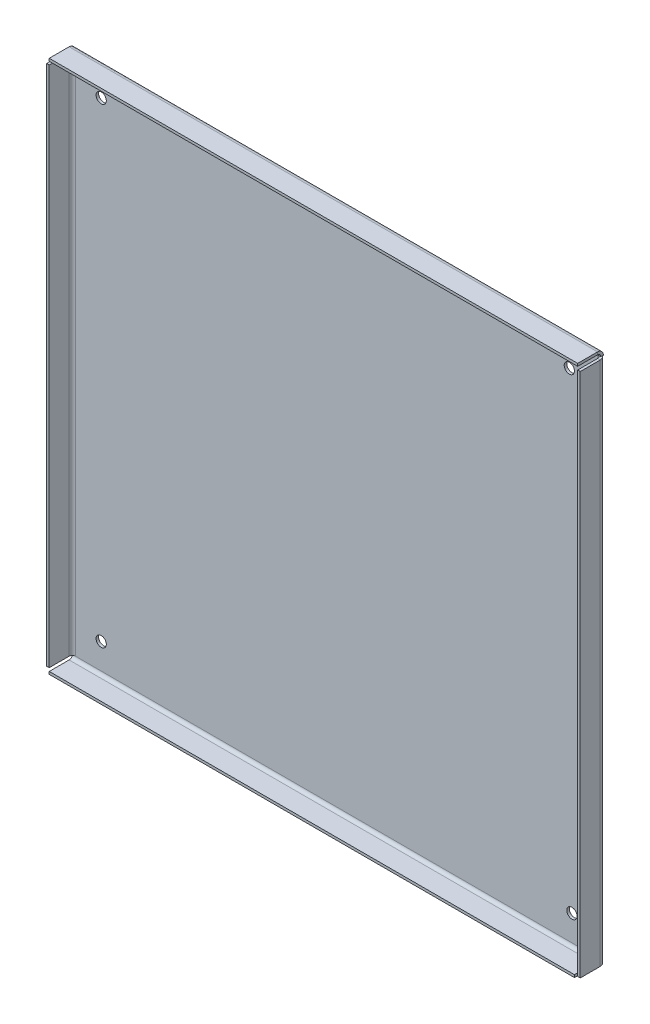
ISO-10303-21;
HEADER;
FILE_DESCRIPTION(('STEP AP214'),'2;1');
FILE_NAME('part.step','',(''),(''),'','','');
FILE_SCHEMA(('AUTOMOTIVE_DESIGN { 1 0 10303 214 1 1 1 1 }'));
ENDSEC;
DATA;
#1=APPLICATION_CONTEXT('core data for automotive mechanical design processes');
#2=APPLICATION_PROTOCOL_DEFINITION('international standard','automotive_design',2000,#1);
#3=PRODUCT_CONTEXT('',#1,'mechanical');
#4=PRODUCT('Part','Part','',(#3));
#5=PRODUCT_RELATED_PRODUCT_CATEGORY('part','',(#4));
#6=PRODUCT_DEFINITION_FORMATION('','',#4);
#7=PRODUCT_DEFINITION_CONTEXT('part definition',#1,'design');
#8=PRODUCT_DEFINITION('design','',#6,#7);
#9=PRODUCT_DEFINITION_SHAPE('','',#8);
#10=(LENGTH_UNIT() NAMED_UNIT(*) SI_UNIT(.MILLI.,.METRE.));
#11=(NAMED_UNIT(*) PLANE_ANGLE_UNIT() SI_UNIT($,.RADIAN.));
#12=(NAMED_UNIT(*) SI_UNIT($,.STERADIAN.) SOLID_ANGLE_UNIT());
#13=UNCERTAINTY_MEASURE_WITH_UNIT(LENGTH_MEASURE(1.E-05),#10,'distance_accuracy_value','');
#14=(GEOMETRIC_REPRESENTATION_CONTEXT(3) GLOBAL_UNCERTAINTY_ASSIGNED_CONTEXT((#13)) GLOBAL_UNIT_ASSIGNED_CONTEXT((#10,
#11,#12)) REPRESENTATION_CONTEXT('',''));
#15=CARTESIAN_POINT('',(0.,0.,0.));
#16=DIRECTION('',(0.,0.,1.));
#17=DIRECTION('',(1.,0.,0.));
#18=AXIS2_PLACEMENT_3D('',#15,#16,#17);
#19=CARTESIAN_POINT('',(-205.,-204.5,0.));
#20=DIRECTION('',(0.,1.,0.));
#21=DIRECTION('',(-1.,0.,0.));
#22=AXIS2_PLACEMENT_3D('',#19,#20,#21);
#23=PLANE('',#22);
#24=DIRECTION('',(0.,0.,-1.));
#25=VECTOR('',#24,1.);
#26=CARTESIAN_POINT('',(-205.,-204.5,0.));
#27=LINE('',#26,#25);
#28=CARTESIAN_POINT('',(-205.,-204.5,-1.24165738677399));
#29=VERTEX_POINT('',#28);
#30=CARTESIAN_POINT('',(-205.,-204.5,-2.00000000000002));
#31=VERTEX_POINT('',#30);
#32=EDGE_CURVE('E56',#29,#31,#27,.T.);
#33=ORIENTED_EDGE('',*,*,#32,.F.);
#34=CARTESIAN_POINT('',(-202.5,-204.5,2.5));
#35=DIRECTION('',(0.,-1.,0.));
#36=DIRECTION('',(0.,0.,-1.));
#37=AXIS2_PLACEMENT_3D('',#34,#35,#36);
#38=CIRCLE('',#37,4.50000000000003);
#39=CARTESIAN_POINT('',(-202.5,-204.5,-2.00000000000002));
#40=VERTEX_POINT('',#39);
#41=EDGE_CURVE('E11',#29,#40,#38,.T.);
#42=ORIENTED_EDGE('',*,*,#41,.T.);
#43=DIRECTION('',(1.,0.,0.));
#44=VECTOR('',#43,1.);
#45=CARTESIAN_POINT('',(204.5,-204.499999999986,-2.00000000000002));
#46=LINE('',#45,#44);
#47=EDGE_CURVE('E270',#31,#40,#46,.T.);
#48=ORIENTED_EDGE('',*,*,#47,.F.);
#49=EDGE_LOOP('',(#33,#42,#48));
#50=FACE_BOUND('',#49,.T.);
#51=ADVANCED_FACE('F39',(#50),#23,.T.);
#52=CARTESIAN_POINT('',(-202.5,202.5,0.));
#53=DIRECTION('',(0.,-1.,0.));
#54=DIRECTION('',(0.,0.,-1.));
#55=AXIS2_PLACEMENT_3D('',#52,#53,#54);
#56=PLANE('',#55);
#57=DIRECTION('',(-1.,0.,0.));
#58=VECTOR('',#57,1.);
#59=CARTESIAN_POINT('',(-205.,202.5,-2.00000000000005));
#60=LINE('',#59,#58);
#61=CARTESIAN_POINT('',(-205.,202.5,-2.00000000000005));
#62=VERTEX_POINT('',#61);
#63=CARTESIAN_POINT('',(-202.5,202.5,-2.00000000000005));
#64=VERTEX_POINT('',#63);
#65=EDGE_CURVE('E422',#62,#64,#60,.F.);
#66=ORIENTED_EDGE('',*,*,#65,.T.);
#67=CARTESIAN_POINT('',(-202.5,202.5,2.49999999999996));
#68=DIRECTION('',(0.,-1.,0.));
#69=DIRECTION('',(0.,0.,-1.));
#70=AXIS2_PLACEMENT_3D('',#67,#68,#69);
#71=CIRCLE('',#70,4.50000000000003);
#72=CARTESIAN_POINT('',(-205.,202.5,-1.24165738677399));
#73=VERTEX_POINT('',#72);
#74=EDGE_CURVE('E255',#64,#73,#71,.F.);
#75=ORIENTED_EDGE('',*,*,#74,.T.);
#76=DIRECTION('',(0.,0.,-1.));
#77=VECTOR('',#76,1.);
#78=CARTESIAN_POINT('',(-205.,202.5,0.));
#79=LINE('',#78,#77);
#80=EDGE_CURVE('E428',#73,#62,#79,.T.);
#81=ORIENTED_EDGE('',*,*,#80,.T.);
#82=EDGE_LOOP('',(#66,#75,#81));
#83=FACE_BOUND('',#82,.T.);
#84=ADVANCED_FACE('F590',(#83),#56,.T.);
#85=CARTESIAN_POINT('',(0.,0.,-2.));
#86=DIRECTION('',(0.,0.,-1.));
#87=DIRECTION('',(-1.,0.,0.));
#88=AXIS2_PLACEMENT_3D('',#85,#86,#87);
#89=PLANE('',#88);
#90=CARTESIAN_POINT('',(-182.5,-184.5,-2.));
#91=DIRECTION('',(0.,0.,-1.));
#92=DIRECTION('',(-1.,0.,0.));
#93=AXIS2_PLACEMENT_3D('',#90,#91,#92);
#94=CIRCLE('',#93,3.99999999999999);
#95=CARTESIAN_POINT('',(-186.5,-184.5,-2.));
#96=VERTEX_POINT('',#95);
#97=EDGE_CURVE('E455',#96,#96,#94,.T.);
#98=ORIENTED_EDGE('',*,*,#97,.F.);
#99=EDGE_LOOP('',(#98));
#100=FACE_BOUND('',#99,.T.);
#101=CARTESIAN_POINT('',(-182.5,182.5,-2.));
#102=DIRECTION('',(0.,0.,-1.));
#103=DIRECTION('',(-1.,0.,0.));
#104=AXIS2_PLACEMENT_3D('',#101,#102,#103);
#105=CIRCLE('',#104,3.99999999999999);
#106=CARTESIAN_POINT('',(-186.5,182.5,-2.));
#107=VERTEX_POINT('',#106);
#108=EDGE_CURVE('E684',#107,#107,#105,.T.);
#109=ORIENTED_EDGE('',*,*,#108,.F.);
#110=EDGE_LOOP('',(#109));
#111=FACE_BOUND('',#110,.T.);
#112=CARTESIAN_POINT('',(182.5,182.5,-2.));
#113=DIRECTION('',(0.,0.,-1.));
#114=DIRECTION('',(-1.,0.,0.));
#115=AXIS2_PLACEMENT_3D('',#112,#113,#114);
#116=CIRCLE('',#115,3.99999999999999);
#117=CARTESIAN_POINT('',(178.5,182.5,-2.));
#118=VERTEX_POINT('',#117);
#119=EDGE_CURVE('E468',#118,#118,#116,.T.);
#120=ORIENTED_EDGE('',*,*,#119,.F.);
#121=EDGE_LOOP('',(#120));
#122=FACE_BOUND('',#121,.T.);
#123=CARTESIAN_POINT('',(184.5,-184.5,-2.));
#124=DIRECTION('',(0.,0.,-1.));
#125=DIRECTION('',(-1.,0.,0.));
#126=AXIS2_PLACEMENT_3D('',#123,#124,#125);
#127=CIRCLE('',#126,3.99999999999999);
#128=CARTESIAN_POINT('',(180.5,-184.5,-2.));
#129=VERTEX_POINT('',#128);
#130=EDGE_CURVE('E451',#129,#129,#127,.T.);
#131=ORIENTED_EDGE('',*,*,#130,.F.);
#132=EDGE_LOOP('',(#131));
#133=FACE_BOUND('',#132,.T.);
#134=DIRECTION('',(1.,0.,0.));
#135=VECTOR('',#134,1.);
#136=CARTESIAN_POINT('',(204.5,-204.5,-2.00000000000002));
#137=LINE('',#136,#135);
#138=CARTESIAN_POINT('',(204.5,-204.5,-1.99999999999999));
#139=VERTEX_POINT('',#138);
#140=EDGE_CURVE('E306',#139,#40,#137,.F.);
#141=ORIENTED_EDGE('',*,*,#140,.T.);
#142=DIRECTION('',(0.,-1.,0.));
#143=VECTOR('',#142,1.);
#144=CARTESIAN_POINT('',(-202.5,-204.5,-2.00000000000003));
#145=LINE('',#144,#143);
#146=EDGE_CURVE('E251',#40,#64,#145,.F.);
#147=ORIENTED_EDGE('',*,*,#146,.T.);
#148=CARTESIAN_POINT('',(204.5,202.5,-2.00000000000002));
#149=VERTEX_POINT('',#148);
#150=EDGE_CURVE('E425',#64,#149,#60,.F.);
#151=ORIENTED_EDGE('',*,*,#150,.T.);
#152=DIRECTION('',(0.,1.,0.));
#153=VECTOR('',#152,1.);
#154=CARTESIAN_POINT('',(204.5,202.5,-1.99999999999999));
#155=LINE('',#154,#153);
#156=EDGE_CURVE('E364',#149,#139,#155,.F.);
#157=ORIENTED_EDGE('',*,*,#156,.T.);
#158=EDGE_LOOP('',(#141,#147,#151,#157));
#159=FACE_BOUND('',#158,.T.);
#160=ADVANCED_FACE('F595',(#100,#111,#122,#133,#159),#89,.T.);
#161=CARTESIAN_POINT('',(0.,0.,0.));
#162=DIRECTION('',(0.,0.,-1.));
#163=DIRECTION('',(-1.,0.,0.));
#164=AXIS2_PLACEMENT_3D('',#161,#162,#163);
#165=PLANE('',#164);
#166=CARTESIAN_POINT('',(-182.5,-184.5,0.));
#167=DIRECTION('',(0.,0.,-1.));
#168=DIRECTION('',(-1.,0.,0.));
#169=AXIS2_PLACEMENT_3D('',#166,#167,#168);
#170=CIRCLE('',#169,3.99999999999999);
#171=CARTESIAN_POINT('',(-186.5,-184.5,0.));
#172=VERTEX_POINT('',#171);
#173=EDGE_CURVE('E43',#172,#172,#170,.T.);
#174=ORIENTED_EDGE('',*,*,#173,.T.);
#175=EDGE_LOOP('',(#174));
#176=FACE_BOUND('',#175,.T.);
#177=CARTESIAN_POINT('',(-182.5,182.5,0.));
#178=DIRECTION('',(0.,0.,-1.));
#179=DIRECTION('',(-1.,0.,0.));
#180=AXIS2_PLACEMENT_3D('',#177,#178,#179);
#181=CIRCLE('',#180,3.99999999999999);
#182=CARTESIAN_POINT('',(-186.5,182.5,0.));
#183=VERTEX_POINT('',#182);
#184=EDGE_CURVE('E454',#183,#183,#181,.T.);
#185=ORIENTED_EDGE('',*,*,#184,.T.);
#186=EDGE_LOOP('',(#185));
#187=FACE_BOUND('',#186,.T.);
#188=CARTESIAN_POINT('',(182.5,182.5,0.));
#189=DIRECTION('',(0.,0.,-1.));
#190=DIRECTION('',(-1.,0.,0.));
#191=AXIS2_PLACEMENT_3D('',#188,#189,#190);
#192=CIRCLE('',#191,3.99999999999999);
#193=CARTESIAN_POINT('',(178.5,182.5,0.));
#194=VERTEX_POINT('',#193);
#195=EDGE_CURVE('E452',#194,#194,#192,.T.);
#196=ORIENTED_EDGE('',*,*,#195,.T.);
#197=EDGE_LOOP('',(#196));
#198=FACE_BOUND('',#197,.T.);
#199=CARTESIAN_POINT('',(184.5,-184.5,0.));
#200=DIRECTION('',(0.,0.,-1.));
#201=DIRECTION('',(-1.,0.,0.));
#202=AXIS2_PLACEMENT_3D('',#199,#200,#201);
#203=CIRCLE('',#202,3.99999999999999);
#204=CARTESIAN_POINT('',(180.5,-184.5,0.));
#205=VERTEX_POINT('',#204);
#206=EDGE_CURVE('E448',#205,#205,#203,.T.);
#207=ORIENTED_EDGE('',*,*,#206,.T.);
#208=EDGE_LOOP('',(#207));
#209=FACE_BOUND('',#208,.T.);
#210=DIRECTION('',(0.,-1.,0.));
#211=VECTOR('',#210,1.);
#212=CARTESIAN_POINT('',(-202.5,-204.5,0.));
#213=LINE('',#212,#211);
#214=CARTESIAN_POINT('',(-202.5,-204.5,0.));
#215=VERTEX_POINT('',#214);
#216=CARTESIAN_POINT('',(-202.5,202.5,0.));
#217=VERTEX_POINT('',#216);
#218=EDGE_CURVE('E263',#215,#217,#213,.F.);
#219=ORIENTED_EDGE('',*,*,#218,.F.);
#220=DIRECTION('',(1.,0.,0.));
#221=VECTOR('',#220,1.);
#222=CARTESIAN_POINT('',(204.5,-204.5,0.));
#223=LINE('',#222,#221);
#224=CARTESIAN_POINT('',(204.5,-204.5,0.));
#225=VERTEX_POINT('',#224);
#226=EDGE_CURVE('E318',#225,#215,#223,.F.);
#227=ORIENTED_EDGE('',*,*,#226,.F.);
#228=DIRECTION('',(0.,1.,0.));
#229=VECTOR('',#228,1.);
#230=CARTESIAN_POINT('',(204.5,202.5,0.));
#231=LINE('',#230,#229);
#232=CARTESIAN_POINT('',(204.5,202.5,0.));
#233=VERTEX_POINT('',#232);
#234=EDGE_CURVE('E377',#233,#225,#231,.F.);
#235=ORIENTED_EDGE('',*,*,#234,.F.);
#236=DIRECTION('',(-1.,0.,0.));
#237=VECTOR('',#236,1.);
#238=CARTESIAN_POINT('',(-205.,202.5,0.));
#239=LINE('',#238,#237);
#240=EDGE_CURVE('E438',#217,#233,#239,.F.);
#241=ORIENTED_EDGE('',*,*,#240,.F.);
#242=EDGE_LOOP('',(#219,#227,#235,#241));
#243=FACE_BOUND('',#242,.T.);
#244=ADVANCED_FACE('F41',(#176,#187,#198,#209,#243),#165,.F.);
#245=CARTESIAN_POINT('',(204.5,-207.,0.));
#246=DIRECTION('',(-1.,0.,0.));
#247=DIRECTION('',(0.,-1.,0.));
#248=AXIS2_PLACEMENT_3D('',#245,#246,#247);
#249=PLANE('',#248);
#250=DIRECTION('',(0.,0.,-1.));
#251=VECTOR('',#250,1.);
#252=CARTESIAN_POINT('',(204.5,-207.,0.));
#253=LINE('',#252,#251);
#254=CARTESIAN_POINT('',(204.5,-207.,-1.24165738677398));
#255=VERTEX_POINT('',#254);
#256=CARTESIAN_POINT('',(204.5,-207.,-1.99999999999999));
#257=VERTEX_POINT('',#256);
#258=EDGE_CURVE('E64',#255,#257,#253,.T.);
#259=ORIENTED_EDGE('',*,*,#258,.F.);
#260=CARTESIAN_POINT('',(204.5,-204.5,2.50000000000001));
#261=DIRECTION('',(1.,0.,0.));
#262=DIRECTION('',(0.,0.,-1.));
#263=AXIS2_PLACEMENT_3D('',#260,#261,#262);
#264=CIRCLE('',#263,4.50000000000003);
#265=EDGE_CURVE('E48',#255,#139,#264,.T.);
#266=ORIENTED_EDGE('',*,*,#265,.T.);
#267=DIRECTION('',(0.,1.,0.));
#268=VECTOR('',#267,1.);
#269=CARTESIAN_POINT('',(204.499999999982,202.5,-1.99999999999999));
#270=LINE('',#269,#268);
#271=EDGE_CURVE('E328',#257,#139,#270,.T.);
#272=ORIENTED_EDGE('',*,*,#271,.F.);
#273=EDGE_LOOP('',(#259,#266,#272));
#274=FACE_BOUND('',#273,.T.);
#275=ADVANCED_FACE('F632',(#274),#249,.T.);
#276=CARTESIAN_POINT('',(207.,202.5,0.));
#277=DIRECTION('',(0.,-1.,0.));
#278=DIRECTION('',(1.,0.,0.));
#279=AXIS2_PLACEMENT_3D('',#276,#277,#278);
#280=PLANE('',#279);
#281=DIRECTION('',(0.,0.,-1.));
#282=VECTOR('',#281,1.);
#283=CARTESIAN_POINT('',(207.,202.5,0.));
#284=LINE('',#283,#282);
#285=CARTESIAN_POINT('',(207.,202.5,-1.24165738677397));
#286=VERTEX_POINT('',#285);
#287=CARTESIAN_POINT('',(207.,202.5,-2.00000000000002));
#288=VERTEX_POINT('',#287);
#289=EDGE_CURVE('E444',#286,#288,#284,.T.);
#290=ORIENTED_EDGE('',*,*,#289,.F.);
#291=CARTESIAN_POINT('',(204.5,202.5,2.50000000000001));
#292=DIRECTION('',(0.,1.,0.));
#293=DIRECTION('',(0.,0.,1.));
#294=AXIS2_PLACEMENT_3D('',#291,#292,#293);
#295=CIRCLE('',#294,4.5);
#296=EDGE_CURVE('E374',#286,#149,#295,.T.);
#297=ORIENTED_EDGE('',*,*,#296,.T.);
#298=DIRECTION('',(-1.,0.,0.));
#299=VECTOR('',#298,1.);
#300=CARTESIAN_POINT('',(-205.,202.499999999977,-2.00000000000005));
#301=LINE('',#300,#299);
#302=EDGE_CURVE('E386',#288,#149,#301,.T.);
#303=ORIENTED_EDGE('',*,*,#302,.F.);
#304=EDGE_LOOP('',(#290,#297,#303));
#305=FACE_BOUND('',#304,.T.);
#306=ADVANCED_FACE('F635',(#305),#280,.T.);
#307=CARTESIAN_POINT('',(207.,202.5,2.50000000000001));
#308=DIRECTION('',(1.,0.,0.));
#309=DIRECTION('',(0.,0.,-1.));
#310=AXIS2_PLACEMENT_3D('',#307,#308,#309);
#311=PLANE('',#310);
#312=DIRECTION('',(0.,1.,0.));
#313=VECTOR('',#312,1.);
#314=CARTESIAN_POINT('',(207.,205.,2.5));
#315=LINE('',#314,#313);
#316=CARTESIAN_POINT('',(207.,205.,2.50000000000001));
#317=VERTEX_POINT('',#316);
#318=CARTESIAN_POINT('',(207.,207.,2.5));
#319=VERTEX_POINT('',#318);
#320=EDGE_CURVE('E389',#317,#319,#315,.T.);
#321=ORIENTED_EDGE('',*,*,#320,.F.);
#322=CARTESIAN_POINT('',(207.,202.5,2.50000000000001));
#323=DIRECTION('',(-1.,0.,0.));
#324=DIRECTION('',(0.,0.,1.));
#325=AXIS2_PLACEMENT_3D('',#322,#323,#324);
#326=CIRCLE('',#325,2.50000000000003);
#327=CARTESIAN_POINT('',(207.,202.5,0.));
#328=VERTEX_POINT('',#327);
#329=EDGE_CURVE('E432',#328,#317,#326,.F.);
#330=ORIENTED_EDGE('',*,*,#329,.F.);
#331=EDGE_CURVE('E441',#328,#286,#284,.T.);
#332=ORIENTED_EDGE('',*,*,#331,.T.);
#333=ORIENTED_EDGE('',*,*,#289,.T.);
#334=CARTESIAN_POINT('',(207.,202.5,2.50000000000001));
#335=DIRECTION('',(-1.,0.,0.));
#336=DIRECTION('',(0.,0.,1.));
#337=AXIS2_PLACEMENT_3D('',#334,#335,#336);
#338=CIRCLE('',#337,4.50000000000003);
#339=EDGE_CURVE('E424',#288,#319,#338,.F.);
#340=ORIENTED_EDGE('',*,*,#339,.T.);
#341=EDGE_LOOP('',(#321,#330,#332,#333,#340));
#342=FACE_BOUND('',#341,.T.);
#343=ADVANCED_FACE('F559',(#342),#311,.T.);
#344=CARTESIAN_POINT('',(-205.,202.5,2.49999999999998));
#345=DIRECTION('',(1.,0.,0.));
#346=DIRECTION('',(0.,0.,-1.));
#347=AXIS2_PLACEMENT_3D('',#344,#345,#346);
#348=PLANE('',#347);
#349=CARTESIAN_POINT('',(-205.,202.5,2.49999999999998));
#350=DIRECTION('',(-1.,0.,0.));
#351=DIRECTION('',(0.,0.,1.));
#352=AXIS2_PLACEMENT_3D('',#349,#350,#351);
#353=CIRCLE('',#352,2.50000000000003);
#354=CARTESIAN_POINT('',(-205.,205.,2.49999999999997));
#355=VERTEX_POINT('',#354);
#356=CARTESIAN_POINT('',(-205.,202.5,0.));
#357=VERTEX_POINT('',#356);
#358=EDGE_CURVE('E419',#355,#357,#353,.T.);
#359=ORIENTED_EDGE('',*,*,#358,.F.);
#360=DIRECTION('',(0.,1.,0.));
#361=VECTOR('',#360,1.);
#362=CARTESIAN_POINT('',(-205.,205.,2.49999999999997));
#363=LINE('',#362,#361);
#364=CARTESIAN_POINT('',(-205.,207.,2.49999999999998));
#365=VERTEX_POINT('',#364);
#366=EDGE_CURVE('E392',#355,#365,#363,.T.);
#367=ORIENTED_EDGE('',*,*,#366,.T.);
#368=CARTESIAN_POINT('',(-205.,202.5,2.49999999999998));
#369=DIRECTION('',(-1.,0.,0.));
#370=DIRECTION('',(0.,0.,1.));
#371=AXIS2_PLACEMENT_3D('',#368,#369,#370);
#372=CIRCLE('',#371,4.50000000000003);
#373=EDGE_CURVE('E429',#365,#62,#372,.T.);
#374=ORIENTED_EDGE('',*,*,#373,.T.);
#375=ORIENTED_EDGE('',*,*,#80,.F.);
#376=EDGE_CURVE('E445',#357,#73,#79,.T.);
#377=ORIENTED_EDGE('',*,*,#376,.F.);
#378=EDGE_LOOP('',(#359,#367,#374,#375,#377));
#379=FACE_BOUND('',#378,.T.);
#380=ADVANCED_FACE('F582',(#379),#348,.F.);
#381=CARTESIAN_POINT('',(-205.,202.5,2.49999999999998));
#382=DIRECTION('',(-1.,0.,0.));
#383=DIRECTION('',(0.,1.,0.));
#384=AXIS2_PLACEMENT_3D('',#381,#382,#383);
#385=CYLINDRICAL_SURFACE('',#384,4.50000000000003);
#386=ORIENTED_EDGE('',*,*,#65,.F.);
#387=ORIENTED_EDGE('',*,*,#373,.F.);
#388=DIRECTION('',(-1.,0.,0.));
#389=VECTOR('',#388,1.);
#390=CARTESIAN_POINT('',(0.,207.,2.49999999999998));
#391=LINE('',#390,#389);
#392=EDGE_CURVE('E395',#319,#365,#391,.T.);
#393=ORIENTED_EDGE('',*,*,#392,.F.);
#394=ORIENTED_EDGE('',*,*,#339,.F.);
#395=ORIENTED_EDGE('',*,*,#302,.T.);
#396=ORIENTED_EDGE('',*,*,#150,.F.);
#397=EDGE_LOOP('',(#386,#387,#393,#394,#395,#396));
#398=FACE_BOUND('',#397,.T.);
#399=ADVANCED_FACE('F598',(#398),#385,.T.);
#400=CARTESIAN_POINT('',(-205.,202.5,2.49999999999998));
#401=DIRECTION('',(-1.,0.,0.));
#402=DIRECTION('',(0.,1.,0.));
#403=AXIS2_PLACEMENT_3D('',#400,#401,#402);
#404=CYLINDRICAL_SURFACE('',#403,2.50000000000003);
#405=EDGE_CURVE('E435',#357,#217,#239,.F.);
#406=ORIENTED_EDGE('',*,*,#405,.T.);
#407=ORIENTED_EDGE('',*,*,#240,.T.);
#408=DIRECTION('',(-1.,0.,0.));
#409=VECTOR('',#408,1.);
#410=CARTESIAN_POINT('',(207.,202.5,0.));
#411=LINE('',#410,#409);
#412=EDGE_CURVE('E383',#328,#233,#411,.T.);
#413=ORIENTED_EDGE('',*,*,#412,.F.);
#414=ORIENTED_EDGE('',*,*,#329,.T.);
#415=DIRECTION('',(-1.,0.,0.));
#416=VECTOR('',#415,1.);
#417=CARTESIAN_POINT('',(207.,205.,2.5));
#418=LINE('',#417,#416);
#419=EDGE_CURVE('E390',#317,#355,#418,.T.);
#420=ORIENTED_EDGE('',*,*,#419,.T.);
#421=ORIENTED_EDGE('',*,*,#358,.T.);
#422=EDGE_LOOP('',(#406,#407,#413,#414,#420,#421));
#423=FACE_BOUND('',#422,.T.);
#424=ADVANCED_FACE('F556',(#423),#404,.F.);
#425=CARTESIAN_POINT('',(-205.,207.,0.));
#426=DIRECTION('',(-1.,0.,0.));
#427=DIRECTION('',(0.,0.,1.));
#428=AXIS2_PLACEMENT_3D('',#425,#426,#427);
#429=PLANE('',#428);
#430=DIRECTION('',(0.,0.,-1.));
#431=VECTOR('',#430,1.);
#432=CARTESIAN_POINT('',(-205.,207.,0.));
#433=LINE('',#432,#431);
#434=CARTESIAN_POINT('',(-205.,207.,18.));
#435=VERTEX_POINT('',#434);
#436=EDGE_CURVE('E407',#435,#365,#433,.T.);
#437=ORIENTED_EDGE('',*,*,#436,.T.);
#438=ORIENTED_EDGE('',*,*,#366,.F.);
#439=DIRECTION('',(0.,0.,-1.));
#440=VECTOR('',#439,1.);
#441=CARTESIAN_POINT('',(-205.,205.,0.));
#442=LINE('',#441,#440);
#443=CARTESIAN_POINT('',(-205.,205.,18.));
#444=VERTEX_POINT('',#443);
#445=EDGE_CURVE('E404',#444,#355,#442,.T.);
#446=ORIENTED_EDGE('',*,*,#445,.F.);
#447=DIRECTION('',(0.,-1.,0.));
#448=VECTOR('',#447,1.);
#449=CARTESIAN_POINT('',(-205.,207.,18.));
#450=LINE('',#449,#448);
#451=EDGE_CURVE('E417',#435,#444,#450,.T.);
#452=ORIENTED_EDGE('',*,*,#451,.F.);
#453=EDGE_LOOP('',(#437,#438,#446,#452));
#454=FACE_BOUND('',#453,.T.);
#455=ADVANCED_FACE('F579',(#454),#429,.T.);
#456=CARTESIAN_POINT('',(207.,207.,18.));
#457=DIRECTION('',(1.,0.,0.));
#458=DIRECTION('',(0.,1.,0.));
#459=AXIS2_PLACEMENT_3D('',#456,#457,#458);
#460=PLANE('',#459);
#461=DIRECTION('',(0.,0.,1.));
#462=VECTOR('',#461,1.);
#463=CARTESIAN_POINT('',(207.,205.,18.));
#464=LINE('',#463,#462);
#465=CARTESIAN_POINT('',(207.,205.,18.));
#466=VERTEX_POINT('',#465);
#467=EDGE_CURVE('E400',#317,#466,#464,.T.);
#468=ORIENTED_EDGE('',*,*,#467,.F.);
#469=ORIENTED_EDGE('',*,*,#320,.T.);
#470=DIRECTION('',(0.,0.,1.));
#471=VECTOR('',#470,1.);
#472=CARTESIAN_POINT('',(207.,207.,18.));
#473=LINE('',#472,#471);
#474=CARTESIAN_POINT('',(207.,207.,18.));
#475=VERTEX_POINT('',#474);
#476=EDGE_CURVE('E401',#319,#475,#473,.T.);
#477=ORIENTED_EDGE('',*,*,#476,.T.);
#478=DIRECTION('',(0.,-1.,0.));
#479=VECTOR('',#478,1.);
#480=CARTESIAN_POINT('',(207.,207.,18.));
#481=LINE('',#480,#479);
#482=EDGE_CURVE('E410',#475,#466,#481,.T.);
#483=ORIENTED_EDGE('',*,*,#482,.T.);
#484=EDGE_LOOP('',(#468,#469,#477,#483));
#485=FACE_BOUND('',#484,.T.);
#486=ADVANCED_FACE('F565',(#485),#460,.T.);
#487=CARTESIAN_POINT('',(0.,207.,-6.39193296144789E-13));
#488=DIRECTION('',(0.,1.,0.));
#489=DIRECTION('',(0.,0.,1.));
#490=AXIS2_PLACEMENT_3D('',#487,#488,#489);
#491=PLANE('',#490);
#492=ORIENTED_EDGE('',*,*,#476,.F.);
#493=ORIENTED_EDGE('',*,*,#392,.T.);
#494=ORIENTED_EDGE('',*,*,#436,.F.);
#495=DIRECTION('',(-1.,0.,0.));
#496=VECTOR('',#495,1.);
#497=CARTESIAN_POINT('',(-205.,207.,18.));
#498=LINE('',#497,#496);
#499=EDGE_CURVE('E403',#475,#435,#498,.T.);
#500=ORIENTED_EDGE('',*,*,#499,.F.);
#501=EDGE_LOOP('',(#492,#493,#494,#500));
#502=FACE_BOUND('',#501,.T.);
#503=ADVANCED_FACE('F569',(#502),#491,.T.);
#504=CARTESIAN_POINT('',(0.,205.,-6.32210333467103E-13));
#505=DIRECTION('',(0.,1.,0.));
#506=DIRECTION('',(0.,0.,1.));
#507=AXIS2_PLACEMENT_3D('',#504,#505,#506);
#508=PLANE('',#507);
#509=ORIENTED_EDGE('',*,*,#419,.F.);
#510=ORIENTED_EDGE('',*,*,#467,.T.);
#511=DIRECTION('',(-1.,0.,0.));
#512=VECTOR('',#511,1.);
#513=CARTESIAN_POINT('',(-205.,205.,18.));
#514=LINE('',#513,#512);
#515=EDGE_CURVE('E412',#466,#444,#514,.T.);
#516=ORIENTED_EDGE('',*,*,#515,.T.);
#517=ORIENTED_EDGE('',*,*,#445,.T.);
#518=EDGE_LOOP('',(#509,#510,#516,#517));
#519=FACE_BOUND('',#518,.T.);
#520=ADVANCED_FACE('F576',(#519),#508,.F.);
#521=CARTESIAN_POINT('',(-205.,207.,18.));
#522=DIRECTION('',(0.,0.,1.));
#523=DIRECTION('',(0.,-1.,0.));
#524=AXIS2_PLACEMENT_3D('',#521,#522,#523);
#525=PLANE('',#524);
#526=ORIENTED_EDGE('',*,*,#515,.F.);
#527=ORIENTED_EDGE('',*,*,#482,.F.);
#528=ORIENTED_EDGE('',*,*,#499,.T.);
#529=ORIENTED_EDGE('',*,*,#451,.T.);
#530=EDGE_LOOP('',(#526,#527,#528,#529));
#531=FACE_BOUND('',#530,.T.);
#532=ADVANCED_FACE('F573',(#531),#525,.T.);
#533=CARTESIAN_POINT('',(204.5,202.5,2.50000000000001));
#534=DIRECTION('',(0.,-1.,0.));
#535=DIRECTION('',(0.,0.,-1.));
#536=AXIS2_PLACEMENT_3D('',#533,#534,#535);
#537=PLANE('',#536);
#538=ORIENTED_EDGE('',*,*,#331,.F.);
#539=ORIENTED_EDGE('',*,*,#412,.T.);
#540=CARTESIAN_POINT('',(204.5,202.5,2.50000000000001));
#541=DIRECTION('',(0.,1.,0.));
#542=DIRECTION('',(0.,0.,1.));
#543=AXIS2_PLACEMENT_3D('',#540,#541,#542);
#544=CIRCLE('',#543,2.5);
#545=CARTESIAN_POINT('',(207.,202.5,2.5));
#546=VERTEX_POINT('',#545);
#547=EDGE_CURVE('E361',#546,#233,#544,.T.);
#548=ORIENTED_EDGE('',*,*,#547,.F.);
#549=DIRECTION('',(1.,0.,0.));
#550=VECTOR('',#549,1.);
#551=CARTESIAN_POINT('',(207.,202.5,2.5));
#552=LINE('',#551,#550);
#553=CARTESIAN_POINT('',(209.,202.5,2.5));
#554=VERTEX_POINT('',#553);
#555=EDGE_CURVE('E334',#546,#554,#552,.T.);
#556=ORIENTED_EDGE('',*,*,#555,.T.);
#557=EDGE_CURVE('E368',#554,#286,#295,.T.);
#558=ORIENTED_EDGE('',*,*,#557,.T.);
#559=EDGE_LOOP('',(#538,#539,#548,#556,#558));
#560=FACE_BOUND('',#559,.T.);
#561=ADVANCED_FACE('F553',(#560),#537,.F.);
#562=CARTESIAN_POINT('',(204.5,-207.,2.50000000000001));
#563=DIRECTION('',(0.,-1.,0.));
#564=DIRECTION('',(0.,0.,-1.));
#565=AXIS2_PLACEMENT_3D('',#562,#563,#564);
#566=PLANE('',#565);
#567=DIRECTION('',(1.,0.,0.));
#568=VECTOR('',#567,1.);
#569=CARTESIAN_POINT('',(207.,-207.,2.5));
#570=LINE('',#569,#568);
#571=CARTESIAN_POINT('',(207.,-207.,2.5));
#572=VERTEX_POINT('',#571);
#573=CARTESIAN_POINT('',(209.,-207.,2.5));
#574=VERTEX_POINT('',#573);
#575=EDGE_CURVE('E331',#572,#574,#570,.T.);
#576=ORIENTED_EDGE('',*,*,#575,.F.);
#577=CARTESIAN_POINT('',(204.5,-207.,2.50000000000001));
#578=DIRECTION('',(0.,1.,0.));
#579=DIRECTION('',(0.,0.,1.));
#580=AXIS2_PLACEMENT_3D('',#577,#578,#579);
#581=CIRCLE('',#580,2.5);
#582=CARTESIAN_POINT('',(204.5,-207.,0.));
#583=VERTEX_POINT('',#582);
#584=EDGE_CURVE('E373',#583,#572,#581,.F.);
#585=ORIENTED_EDGE('',*,*,#584,.F.);
#586=EDGE_CURVE('E381',#583,#255,#253,.T.);
#587=ORIENTED_EDGE('',*,*,#586,.T.);
#588=ORIENTED_EDGE('',*,*,#258,.T.);
#589=CARTESIAN_POINT('',(204.5,-207.,2.50000000000001));
#590=DIRECTION('',(0.,1.,0.));
#591=DIRECTION('',(0.,0.,1.));
#592=AXIS2_PLACEMENT_3D('',#589,#590,#591);
#593=CIRCLE('',#592,4.5);
#594=EDGE_CURVE('E367',#257,#574,#593,.F.);
#595=ORIENTED_EDGE('',*,*,#594,.T.);
#596=EDGE_LOOP('',(#576,#585,#587,#588,#595));
#597=FACE_BOUND('',#596,.T.);
#598=ADVANCED_FACE('F529',(#597),#566,.T.);
#599=CARTESIAN_POINT('',(204.5,202.5,2.50000000000001));
#600=DIRECTION('',(0.,1.,0.));
#601=DIRECTION('',(1.,0.,0.));
#602=AXIS2_PLACEMENT_3D('',#599,#600,#601);
#603=CYLINDRICAL_SURFACE('',#602,4.5);
#604=ORIENTED_EDGE('',*,*,#156,.F.);
#605=ORIENTED_EDGE('',*,*,#296,.F.);
#606=ORIENTED_EDGE('',*,*,#557,.F.);
#607=DIRECTION('',(0.,1.,0.));
#608=VECTOR('',#607,1.);
#609=CARTESIAN_POINT('',(209.,0.,2.5));
#610=LINE('',#609,#608);
#611=EDGE_CURVE('E337',#574,#554,#610,.T.);
#612=ORIENTED_EDGE('',*,*,#611,.F.);
#613=ORIENTED_EDGE('',*,*,#594,.F.);
#614=ORIENTED_EDGE('',*,*,#271,.T.);
#615=EDGE_LOOP('',(#604,#605,#606,#612,#613,#614));
#616=FACE_BOUND('',#615,.T.);
#617=ADVANCED_FACE('F603',(#616),#603,.T.);
#618=CARTESIAN_POINT('',(204.5,202.5,2.50000000000001));
#619=DIRECTION('',(0.,1.,0.));
#620=DIRECTION('',(1.,0.,0.));
#621=AXIS2_PLACEMENT_3D('',#618,#619,#620);
#622=CYLINDRICAL_SURFACE('',#621,2.5);
#623=ORIENTED_EDGE('',*,*,#234,.T.);
#624=DIRECTION('',(0.,1.,0.));
#625=VECTOR('',#624,1.);
#626=CARTESIAN_POINT('',(204.5,-207.,0.));
#627=LINE('',#626,#625);
#628=EDGE_CURVE('E325',#583,#225,#627,.T.);
#629=ORIENTED_EDGE('',*,*,#628,.F.);
#630=ORIENTED_EDGE('',*,*,#584,.T.);
#631=DIRECTION('',(0.,1.,0.));
#632=VECTOR('',#631,1.);
#633=CARTESIAN_POINT('',(207.,-207.,2.5));
#634=LINE('',#633,#632);
#635=EDGE_CURVE('E332',#572,#546,#634,.T.);
#636=ORIENTED_EDGE('',*,*,#635,.T.);
#637=ORIENTED_EDGE('',*,*,#547,.T.);
#638=EDGE_LOOP('',(#623,#629,#630,#636,#637));
#639=FACE_BOUND('',#638,.T.);
#640=ADVANCED_FACE('F525',(#639),#622,.F.);
#641=CARTESIAN_POINT('',(209.,202.5,0.));
#642=DIRECTION('',(0.,1.,0.));
#643=DIRECTION('',(-1.,0.,0.));
#644=AXIS2_PLACEMENT_3D('',#641,#642,#643);
#645=PLANE('',#644);
#646=DIRECTION('',(0.,0.,-1.));
#647=VECTOR('',#646,1.);
#648=CARTESIAN_POINT('',(209.,202.5,0.));
#649=LINE('',#648,#647);
#650=CARTESIAN_POINT('',(209.,202.5,18.));
#651=VERTEX_POINT('',#650);
#652=EDGE_CURVE('E349',#651,#554,#649,.T.);
#653=ORIENTED_EDGE('',*,*,#652,.T.);
#654=ORIENTED_EDGE('',*,*,#555,.F.);
#655=DIRECTION('',(0.,0.,-1.));
#656=VECTOR('',#655,1.);
#657=CARTESIAN_POINT('',(207.,202.5,0.));
#658=LINE('',#657,#656);
#659=CARTESIAN_POINT('',(207.,202.5,18.));
#660=VERTEX_POINT('',#659);
#661=EDGE_CURVE('E346',#660,#546,#658,.T.);
#662=ORIENTED_EDGE('',*,*,#661,.F.);
#663=DIRECTION('',(-1.,0.,0.));
#664=VECTOR('',#663,1.);
#665=CARTESIAN_POINT('',(209.,202.5,18.));
#666=LINE('',#665,#664);
#667=EDGE_CURVE('E359',#651,#660,#666,.T.);
#668=ORIENTED_EDGE('',*,*,#667,.F.);
#669=EDGE_LOOP('',(#653,#654,#662,#668));
#670=FACE_BOUND('',#669,.T.);
#671=ADVANCED_FACE('F549',(#670),#645,.T.);
#672=CARTESIAN_POINT('',(209.,-207.,18.));
#673=DIRECTION('',(0.,-1.,0.));
#674=DIRECTION('',(1.,0.,0.));
#675=AXIS2_PLACEMENT_3D('',#672,#673,#674);
#676=PLANE('',#675);
#677=DIRECTION('',(0.,0.,1.));
#678=VECTOR('',#677,1.);
#679=CARTESIAN_POINT('',(207.,-207.,18.));
#680=LINE('',#679,#678);
#681=CARTESIAN_POINT('',(207.,-207.,18.));
#682=VERTEX_POINT('',#681);
#683=EDGE_CURVE('E342',#572,#682,#680,.T.);
#684=ORIENTED_EDGE('',*,*,#683,.F.);
#685=ORIENTED_EDGE('',*,*,#575,.T.);
#686=DIRECTION('',(0.,0.,1.));
#687=VECTOR('',#686,1.);
#688=CARTESIAN_POINT('',(209.,-207.,18.));
#689=LINE('',#688,#687);
#690=CARTESIAN_POINT('',(209.,-207.,18.));
#691=VERTEX_POINT('',#690);
#692=EDGE_CURVE('E343',#574,#691,#689,.T.);
#693=ORIENTED_EDGE('',*,*,#692,.T.);
#694=DIRECTION('',(-1.,0.,0.));
#695=VECTOR('',#694,1.);
#696=CARTESIAN_POINT('',(209.,-207.,18.));
#697=LINE('',#696,#695);
#698=EDGE_CURVE('E352',#691,#682,#697,.T.);
#699=ORIENTED_EDGE('',*,*,#698,.T.);
#700=EDGE_LOOP('',(#684,#685,#693,#699));
#701=FACE_BOUND('',#700,.T.);
#702=ADVANCED_FACE('F535',(#701),#676,.T.);
#703=CARTESIAN_POINT('',(209.,0.,-6.45361201837152E-13));
#704=DIRECTION('',(1.,0.,0.));
#705=DIRECTION('',(0.,0.,-1.));
#706=AXIS2_PLACEMENT_3D('',#703,#704,#705);
#707=PLANE('',#706);
#708=ORIENTED_EDGE('',*,*,#692,.F.);
#709=ORIENTED_EDGE('',*,*,#611,.T.);
#710=ORIENTED_EDGE('',*,*,#652,.F.);
#711=DIRECTION('',(0.,1.,0.));
#712=VECTOR('',#711,1.);
#713=CARTESIAN_POINT('',(209.,202.5,18.));
#714=LINE('',#713,#712);
#715=EDGE_CURVE('E345',#691,#651,#714,.T.);
#716=ORIENTED_EDGE('',*,*,#715,.F.);
#717=EDGE_LOOP('',(#708,#709,#710,#716));
#718=FACE_BOUND('',#717,.T.);
#719=ADVANCED_FACE('F539',(#718),#707,.T.);
#720=CARTESIAN_POINT('',(207.,0.,-6.38378239159465E-13));
#721=DIRECTION('',(1.,0.,0.));
#722=DIRECTION('',(0.,0.,-1.));
#723=AXIS2_PLACEMENT_3D('',#720,#721,#722);
#724=PLANE('',#723);
#725=ORIENTED_EDGE('',*,*,#635,.F.);
#726=ORIENTED_EDGE('',*,*,#683,.T.);
#727=DIRECTION('',(0.,1.,0.));
#728=VECTOR('',#727,1.);
#729=CARTESIAN_POINT('',(207.,202.5,18.));
#730=LINE('',#729,#728);
#731=EDGE_CURVE('E354',#682,#660,#730,.T.);
#732=ORIENTED_EDGE('',*,*,#731,.T.);
#733=ORIENTED_EDGE('',*,*,#661,.T.);
#734=EDGE_LOOP('',(#725,#726,#732,#733));
#735=FACE_BOUND('',#734,.T.);
#736=ADVANCED_FACE('F546',(#735),#724,.F.);
#737=CARTESIAN_POINT('',(209.,202.5,18.));
#738=DIRECTION('',(0.,0.,1.));
#739=DIRECTION('',(1.,0.,0.));
#740=AXIS2_PLACEMENT_3D('',#737,#738,#739);
#741=PLANE('',#740);
#742=ORIENTED_EDGE('',*,*,#731,.F.);
#743=ORIENTED_EDGE('',*,*,#698,.F.);
#744=ORIENTED_EDGE('',*,*,#715,.T.);
#745=ORIENTED_EDGE('',*,*,#667,.T.);
#746=EDGE_LOOP('',(#742,#743,#744,#745));
#747=FACE_BOUND('',#746,.T.);
#748=ADVANCED_FACE('F543',(#747),#741,.T.);
#749=CARTESIAN_POINT('',(204.5,-204.5,2.50000000000001));
#750=DIRECTION('',(-1.,0.,0.));
#751=DIRECTION('',(0.,0.,1.));
#752=AXIS2_PLACEMENT_3D('',#749,#750,#751);
#753=PLANE('',#752);
#754=ORIENTED_EDGE('',*,*,#586,.F.);
#755=ORIENTED_EDGE('',*,*,#628,.T.);
#756=CARTESIAN_POINT('',(204.5,-204.5,2.50000000000001));
#757=DIRECTION('',(1.,0.,0.));
#758=DIRECTION('',(0.,0.,-1.));
#759=AXIS2_PLACEMENT_3D('',#756,#757,#758);
#760=CIRCLE('',#759,2.50000000000003);
#761=CARTESIAN_POINT('',(204.5,-207.,2.5));
#762=VERTEX_POINT('',#761);
#763=EDGE_CURVE('E303',#762,#225,#760,.T.);
#764=ORIENTED_EDGE('',*,*,#763,.F.);
#765=DIRECTION('',(0.,-1.,0.));
#766=VECTOR('',#765,1.);
#767=CARTESIAN_POINT('',(204.5,-207.,2.5));
#768=LINE('',#767,#766);
#769=CARTESIAN_POINT('',(204.5,-209.,2.5));
#770=VERTEX_POINT('',#769);
#771=EDGE_CURVE('E276',#762,#770,#768,.T.);
#772=ORIENTED_EDGE('',*,*,#771,.T.);
#773=EDGE_CURVE('E310',#770,#255,#264,.T.);
#774=ORIENTED_EDGE('',*,*,#773,.T.);
#775=EDGE_LOOP('',(#754,#755,#764,#772,#774));
#776=FACE_BOUND('',#775,.T.);
#777=ADVANCED_FACE('F522',(#776),#753,.F.);
#778=CARTESIAN_POINT('',(-205.,-204.5,2.50000000000001));
#779=DIRECTION('',(-1.,0.,0.));
#780=DIRECTION('',(0.,0.,1.));
#781=AXIS2_PLACEMENT_3D('',#778,#779,#780);
#782=PLANE('',#781);
#783=DIRECTION('',(0.,-1.,0.));
#784=VECTOR('',#783,1.);
#785=CARTESIAN_POINT('',(-205.,-207.,2.5));
#786=LINE('',#785,#784);
#787=CARTESIAN_POINT('',(-205.,-207.,2.5));
#788=VERTEX_POINT('',#787);
#789=CARTESIAN_POINT('',(-205.,-209.,2.5));
#790=VERTEX_POINT('',#789);
#791=EDGE_CURVE('E273',#788,#790,#786,.T.);
#792=ORIENTED_EDGE('',*,*,#791,.F.);
#793=CARTESIAN_POINT('',(-205.,-204.5,2.50000000000001));
#794=DIRECTION('',(1.,0.,0.));
#795=DIRECTION('',(0.,0.,-1.));
#796=AXIS2_PLACEMENT_3D('',#793,#794,#795);
#797=CIRCLE('',#796,2.50000000000003);
#798=CARTESIAN_POINT('',(-205.,-204.5,0.));
#799=VERTEX_POINT('',#798);
#800=EDGE_CURVE('E315',#799,#788,#797,.F.);
#801=ORIENTED_EDGE('',*,*,#800,.F.);
#802=EDGE_CURVE('E323',#799,#29,#27,.T.);
#803=ORIENTED_EDGE('',*,*,#802,.T.);
#804=ORIENTED_EDGE('',*,*,#32,.T.);
#805=CARTESIAN_POINT('',(-205.,-204.5,2.50000000000001));
#806=DIRECTION('',(1.,0.,0.));
#807=DIRECTION('',(0.,0.,-1.));
#808=AXIS2_PLACEMENT_3D('',#805,#806,#807);
#809=CIRCLE('',#808,4.50000000000003);
#810=EDGE_CURVE('E309',#31,#790,#809,.F.);
#811=ORIENTED_EDGE('',*,*,#810,.T.);
#812=EDGE_LOOP('',(#792,#801,#803,#804,#811));
#813=FACE_BOUND('',#812,.T.);
#814=ADVANCED_FACE('F498',(#813),#782,.T.);
#815=CARTESIAN_POINT('',(204.5,-204.5,2.50000000000001));
#816=DIRECTION('',(1.,0.,0.));
#817=DIRECTION('',(0.,-1.,0.));
#818=AXIS2_PLACEMENT_3D('',#815,#816,#817);
#819=CYLINDRICAL_SURFACE('',#818,4.50000000000003);
#820=ORIENTED_EDGE('',*,*,#140,.F.);
#821=ORIENTED_EDGE('',*,*,#265,.F.);
#822=ORIENTED_EDGE('',*,*,#773,.F.);
#823=DIRECTION('',(1.,0.,0.));
#824=VECTOR('',#823,1.);
#825=CARTESIAN_POINT('',(0.,-209.,2.5));
#826=LINE('',#825,#824);
#827=EDGE_CURVE('E279',#790,#770,#826,.T.);
#828=ORIENTED_EDGE('',*,*,#827,.F.);
#829=ORIENTED_EDGE('',*,*,#810,.F.);
#830=ORIENTED_EDGE('',*,*,#47,.T.);
#831=EDGE_LOOP('',(#820,#821,#822,#828,#829,#830));
#832=FACE_BOUND('',#831,.T.);
#833=ADVANCED_FACE('F605',(#832),#819,.T.);
#834=CARTESIAN_POINT('',(204.5,-204.5,2.50000000000001));
#835=DIRECTION('',(1.,0.,0.));
#836=DIRECTION('',(0.,-1.,0.));
#837=AXIS2_PLACEMENT_3D('',#834,#835,#836);
#838=CYLINDRICAL_SURFACE('',#837,2.50000000000003);
#839=ORIENTED_EDGE('',*,*,#226,.T.);
#840=DIRECTION('',(1.,0.,0.));
#841=VECTOR('',#840,1.);
#842=CARTESIAN_POINT('',(-205.,-204.5,0.));
#843=LINE('',#842,#841);
#844=EDGE_CURVE('E257',#799,#215,#843,.T.);
#845=ORIENTED_EDGE('',*,*,#844,.F.);
#846=ORIENTED_EDGE('',*,*,#800,.T.);
#847=DIRECTION('',(1.,0.,0.));
#848=VECTOR('',#847,1.);
#849=CARTESIAN_POINT('',(-205.,-207.,2.5));
#850=LINE('',#849,#848);
#851=EDGE_CURVE('E274',#788,#762,#850,.T.);
#852=ORIENTED_EDGE('',*,*,#851,.T.);
#853=ORIENTED_EDGE('',*,*,#763,.T.);
#854=EDGE_LOOP('',(#839,#845,#846,#852,#853));
#855=FACE_BOUND('',#854,.T.);
#856=ADVANCED_FACE('F494',(#855),#838,.F.);
#857=CARTESIAN_POINT('',(204.5,-209.,0.));
#858=DIRECTION('',(1.,0.,0.));
#859=DIRECTION('',(0.,1.,0.));
#860=AXIS2_PLACEMENT_3D('',#857,#858,#859);
#861=PLANE('',#860);
#862=DIRECTION('',(0.,0.,-1.));
#863=VECTOR('',#862,1.);
#864=CARTESIAN_POINT('',(204.5,-209.,0.));
#865=LINE('',#864,#863);
#866=CARTESIAN_POINT('',(204.5,-209.,18.));
#867=VERTEX_POINT('',#866);
#868=EDGE_CURVE('E291',#867,#770,#865,.T.);
#869=ORIENTED_EDGE('',*,*,#868,.T.);
#870=ORIENTED_EDGE('',*,*,#771,.F.);
#871=DIRECTION('',(0.,0.,-1.));
#872=VECTOR('',#871,1.);
#873=CARTESIAN_POINT('',(204.5,-207.,0.));
#874=LINE('',#873,#872);
#875=CARTESIAN_POINT('',(204.5,-207.,18.));
#876=VERTEX_POINT('',#875);
#877=EDGE_CURVE('E288',#876,#762,#874,.T.);
#878=ORIENTED_EDGE('',*,*,#877,.F.);
#879=DIRECTION('',(0.,1.,0.));
#880=VECTOR('',#879,1.);
#881=CARTESIAN_POINT('',(204.5,-209.,18.));
#882=LINE('',#881,#880);
#883=EDGE_CURVE('E301',#867,#876,#882,.T.);
#884=ORIENTED_EDGE('',*,*,#883,.F.);
#885=EDGE_LOOP('',(#869,#870,#878,#884));
#886=FACE_BOUND('',#885,.T.);
#887=ADVANCED_FACE('F518',(#886),#861,.T.);
#888=CARTESIAN_POINT('',(-205.,-209.,18.));
#889=DIRECTION('',(-1.,0.,0.));
#890=DIRECTION('',(0.,0.,1.));
#891=AXIS2_PLACEMENT_3D('',#888,#889,#890);
#892=PLANE('',#891);
#893=DIRECTION('',(0.,0.,1.));
#894=VECTOR('',#893,1.);
#895=CARTESIAN_POINT('',(-205.,-207.,18.));
#896=LINE('',#895,#894);
#897=CARTESIAN_POINT('',(-205.,-207.,18.));
#898=VERTEX_POINT('',#897);
#899=EDGE_CURVE('E284',#788,#898,#896,.T.);
#900=ORIENTED_EDGE('',*,*,#899,.F.);
#901=ORIENTED_EDGE('',*,*,#791,.T.);
#902=DIRECTION('',(0.,0.,1.));
#903=VECTOR('',#902,1.);
#904=CARTESIAN_POINT('',(-205.,-209.,18.));
#905=LINE('',#904,#903);
#906=CARTESIAN_POINT('',(-205.,-209.,18.));
#907=VERTEX_POINT('',#906);
#908=EDGE_CURVE('E285',#790,#907,#905,.T.);
#909=ORIENTED_EDGE('',*,*,#908,.T.);
#910=DIRECTION('',(0.,1.,0.));
#911=VECTOR('',#910,1.);
#912=CARTESIAN_POINT('',(-205.,-209.,18.));
#913=LINE('',#912,#911);
#914=EDGE_CURVE('E294',#907,#898,#913,.T.);
#915=ORIENTED_EDGE('',*,*,#914,.T.);
#916=EDGE_LOOP('',(#900,#901,#909,#915));
#917=FACE_BOUND('',#916,.T.);
#918=ADVANCED_FACE('F504',(#917),#892,.T.);
#919=CARTESIAN_POINT('',(0.,-209.,-6.45361201837152E-13));
#920=DIRECTION('',(0.,-1.,0.));
#921=DIRECTION('',(0.,0.,-1.));
#922=AXIS2_PLACEMENT_3D('',#919,#920,#921);
#923=PLANE('',#922);
#924=ORIENTED_EDGE('',*,*,#908,.F.);
#925=ORIENTED_EDGE('',*,*,#827,.T.);
#926=ORIENTED_EDGE('',*,*,#868,.F.);
#927=DIRECTION('',(1.,0.,0.));
#928=VECTOR('',#927,1.);
#929=CARTESIAN_POINT('',(204.5,-209.,18.));
#930=LINE('',#929,#928);
#931=EDGE_CURVE('E287',#907,#867,#930,.T.);
#932=ORIENTED_EDGE('',*,*,#931,.F.);
#933=EDGE_LOOP('',(#924,#925,#926,#932));
#934=FACE_BOUND('',#933,.T.);
#935=ADVANCED_FACE('F508',(#934),#923,.T.);
#936=CARTESIAN_POINT('',(0.,-207.,-6.38378239159465E-13));
#937=DIRECTION('',(0.,-1.,0.));
#938=DIRECTION('',(0.,0.,-1.));
#939=AXIS2_PLACEMENT_3D('',#936,#937,#938);
#940=PLANE('',#939);
#941=ORIENTED_EDGE('',*,*,#851,.F.);
#942=ORIENTED_EDGE('',*,*,#899,.T.);
#943=DIRECTION('',(1.,0.,0.));
#944=VECTOR('',#943,1.);
#945=CARTESIAN_POINT('',(204.5,-207.,18.));
#946=LINE('',#945,#944);
#947=EDGE_CURVE('E296',#898,#876,#946,.T.);
#948=ORIENTED_EDGE('',*,*,#947,.T.);
#949=ORIENTED_EDGE('',*,*,#877,.T.);
#950=EDGE_LOOP('',(#941,#942,#948,#949));
#951=FACE_BOUND('',#950,.T.);
#952=ADVANCED_FACE('F515',(#951),#940,.F.);
#953=CARTESIAN_POINT('',(204.5,-209.,18.));
#954=DIRECTION('',(0.,0.,1.));
#955=DIRECTION('',(0.,-1.,0.));
#956=AXIS2_PLACEMENT_3D('',#953,#954,#955);
#957=PLANE('',#956);
#958=ORIENTED_EDGE('',*,*,#947,.F.);
#959=ORIENTED_EDGE('',*,*,#914,.F.);
#960=ORIENTED_EDGE('',*,*,#931,.T.);
#961=ORIENTED_EDGE('',*,*,#883,.T.);
#962=EDGE_LOOP('',(#958,#959,#960,#961));
#963=FACE_BOUND('',#962,.T.);
#964=ADVANCED_FACE('F512',(#963),#957,.T.);
#965=CARTESIAN_POINT('',(-202.5,-204.5,2.5));
#966=DIRECTION('',(0.,1.,0.));
#967=DIRECTION('',(0.,0.,1.));
#968=AXIS2_PLACEMENT_3D('',#965,#966,#967);
#969=PLANE('',#968);
#970=ORIENTED_EDGE('',*,*,#802,.F.);
#971=ORIENTED_EDGE('',*,*,#844,.T.);
#972=CARTESIAN_POINT('',(-202.5,-204.5,2.5));
#973=DIRECTION('',(0.,-1.,0.));
#974=DIRECTION('',(0.,0.,-1.));
#975=AXIS2_PLACEMENT_3D('',#972,#973,#974);
#976=CIRCLE('',#975,2.50000000000003);
#977=CARTESIAN_POINT('',(-205.,-204.5,2.49999999999999));
#978=VERTEX_POINT('',#977);
#979=EDGE_CURVE('E249',#978,#215,#976,.T.);
#980=ORIENTED_EDGE('',*,*,#979,.F.);
#981=DIRECTION('',(-1.,0.,0.));
#982=VECTOR('',#981,1.);
#983=CARTESIAN_POINT('',(-205.,-204.5,2.5));
#984=LINE('',#983,#982);
#985=CARTESIAN_POINT('',(-207.,-204.5,2.49999999999997));
#986=VERTEX_POINT('',#985);
#987=EDGE_CURVE('E472',#978,#986,#984,.T.);
#988=ORIENTED_EDGE('',*,*,#987,.T.);
#989=EDGE_CURVE('E50',#986,#29,#38,.T.);
#990=ORIENTED_EDGE('',*,*,#989,.T.);
#991=EDGE_LOOP('',(#970,#971,#980,#988,#990));
#992=FACE_BOUND('',#991,.T.);
#993=ADVANCED_FACE('F491',(#992),#969,.F.);
#994=CARTESIAN_POINT('',(-202.5,202.5,2.49999999999996));
#995=DIRECTION('',(0.,1.,0.));
#996=DIRECTION('',(0.,0.,1.));
#997=AXIS2_PLACEMENT_3D('',#994,#995,#996);
#998=PLANE('',#997);
#999=ORIENTED_EDGE('',*,*,#405,.F.);
#1000=ORIENTED_EDGE('',*,*,#376,.T.);
#1001=CARTESIAN_POINT('',(-207.,202.5,2.49999999999995));
#1002=VERTEX_POINT('',#1001);
#1003=EDGE_CURVE('E254',#73,#1002,#71,.F.);
#1004=ORIENTED_EDGE('',*,*,#1003,.T.);
#1005=DIRECTION('',(-1.,0.,0.));
#1006=VECTOR('',#1005,1.);
#1007=CARTESIAN_POINT('',(-205.,202.5,2.49999999999995));
#1008=LINE('',#1007,#1006);
#1009=CARTESIAN_POINT('',(-205.,202.5,2.49999999999996));
#1010=VERTEX_POINT('',#1009);
#1011=EDGE_CURVE('E221',#1010,#1002,#1008,.T.);
#1012=ORIENTED_EDGE('',*,*,#1011,.F.);
#1013=CARTESIAN_POINT('',(-202.5,202.5,2.49999999999996));
#1014=DIRECTION('',(0.,-1.,0.));
#1015=DIRECTION('',(0.,0.,-1.));
#1016=AXIS2_PLACEMENT_3D('',#1013,#1014,#1015);
#1017=CIRCLE('',#1016,2.50000000000003);
#1018=EDGE_CURVE('E260',#217,#1010,#1017,.F.);
#1019=ORIENTED_EDGE('',*,*,#1018,.F.);
#1020=EDGE_LOOP('',(#999,#1000,#1004,#1012,#1019));
#1021=FACE_BOUND('',#1020,.T.);
#1022=ADVANCED_FACE('F585',(#1021),#998,.T.);
#1023=CARTESIAN_POINT('',(-202.5,-204.5,2.5));
#1024=DIRECTION('',(0.,-1.,0.));
#1025=DIRECTION('',(-1.,0.,0.));
#1026=AXIS2_PLACEMENT_3D('',#1023,#1024,#1025);
#1027=CYLINDRICAL_SURFACE('',#1026,4.50000000000003);
#1028=ORIENTED_EDGE('',*,*,#146,.F.);
#1029=ORIENTED_EDGE('',*,*,#41,.F.);
#1030=ORIENTED_EDGE('',*,*,#989,.F.);
#1031=DIRECTION('',(0.,-1.,0.));
#1032=VECTOR('',#1031,1.);
#1033=CARTESIAN_POINT('',(-207.,0.,2.49999999999997));
#1034=LINE('',#1033,#1032);
#1035=EDGE_CURVE('E245',#1002,#986,#1034,.T.);
#1036=ORIENTED_EDGE('',*,*,#1035,.F.);
#1037=ORIENTED_EDGE('',*,*,#1003,.F.);
#1038=ORIENTED_EDGE('',*,*,#74,.F.);
#1039=EDGE_LOOP('',(#1028,#1029,#1030,#1036,#1037,#1038));
#1040=FACE_BOUND('',#1039,.T.);
#1041=ADVANCED_FACE('F588',(#1040),#1027,.T.);
#1042=CARTESIAN_POINT('',(-202.5,-204.5,2.5));
#1043=DIRECTION('',(0.,-1.,0.));
#1044=DIRECTION('',(-1.,0.,0.));
#1045=AXIS2_PLACEMENT_3D('',#1042,#1043,#1044);
#1046=CYLINDRICAL_SURFACE('',#1045,2.50000000000003);
#1047=ORIENTED_EDGE('',*,*,#218,.T.);
#1048=ORIENTED_EDGE('',*,*,#1018,.T.);
#1049=DIRECTION('',(0.,-1.,0.));
#1050=VECTOR('',#1049,1.);
#1051=CARTESIAN_POINT('',(-205.,202.5,2.49999999999995));
#1052=LINE('',#1051,#1050);
#1053=EDGE_CURVE('E470',#1010,#978,#1052,.T.);
#1054=ORIENTED_EDGE('',*,*,#1053,.T.);
#1055=ORIENTED_EDGE('',*,*,#979,.T.);
#1056=EDGE_LOOP('',(#1047,#1048,#1054,#1055));
#1057=FACE_BOUND('',#1056,.T.);
#1058=ADVANCED_FACE('F487',(#1057),#1046,.F.);
#1059=CARTESIAN_POINT('',(-207.,-204.5,0.));
#1060=DIRECTION('',(0.,-1.,0.));
#1061=DIRECTION('',(1.,0.,0.));
#1062=AXIS2_PLACEMENT_3D('',#1059,#1060,#1061);
#1063=PLANE('',#1062);
#1064=DIRECTION('',(0.,0.,-1.));
#1065=VECTOR('',#1064,1.);
#1066=CARTESIAN_POINT('',(-207.,-204.5,0.));
#1067=LINE('',#1066,#1065);
#1068=CARTESIAN_POINT('',(-207.,-204.5,18.));
#1069=VERTEX_POINT('',#1068);
#1070=EDGE_CURVE('E235',#1069,#986,#1067,.T.);
#1071=ORIENTED_EDGE('',*,*,#1070,.T.);
#1072=ORIENTED_EDGE('',*,*,#987,.F.);
#1073=DIRECTION('',(0.,0.,-1.));
#1074=VECTOR('',#1073,1.);
#1075=CARTESIAN_POINT('',(-205.,-204.5,0.));
#1076=LINE('',#1075,#1074);
#1077=CARTESIAN_POINT('',(-205.,-204.5,18.));
#1078=VERTEX_POINT('',#1077);
#1079=EDGE_CURVE('E226',#1078,#978,#1076,.T.);
#1080=ORIENTED_EDGE('',*,*,#1079,.F.);
#1081=DIRECTION('',(1.,0.,0.));
#1082=VECTOR('',#1081,1.);
#1083=CARTESIAN_POINT('',(-207.,-204.5,18.));
#1084=LINE('',#1083,#1082);
#1085=EDGE_CURVE('E234',#1069,#1078,#1084,.T.);
#1086=ORIENTED_EDGE('',*,*,#1085,.F.);
#1087=EDGE_LOOP('',(#1071,#1072,#1080,#1086));
#1088=FACE_BOUND('',#1087,.T.);
#1089=ADVANCED_FACE('F480',(#1088),#1063,.T.);
#1090=CARTESIAN_POINT('',(-207.,202.5,17.9999999999999));
#1091=DIRECTION('',(0.,1.,0.));
#1092=DIRECTION('',(0.,0.,1.));
#1093=AXIS2_PLACEMENT_3D('',#1090,#1091,#1092);
#1094=PLANE('',#1093);
#1095=DIRECTION('',(0.,0.,1.));
#1096=VECTOR('',#1095,1.);
#1097=CARTESIAN_POINT('',(-205.,202.5,17.9999999999999));
#1098=LINE('',#1097,#1096);
#1099=CARTESIAN_POINT('',(-205.,202.5,17.9999999999999));
#1100=VERTEX_POINT('',#1099);
#1101=EDGE_CURVE('E243',#1010,#1100,#1098,.T.);
#1102=ORIENTED_EDGE('',*,*,#1101,.F.);
#1103=ORIENTED_EDGE('',*,*,#1011,.T.);
#1104=DIRECTION('',(0.,0.,1.));
#1105=VECTOR('',#1104,1.);
#1106=CARTESIAN_POINT('',(-207.,202.5,17.9999999999999));
#1107=LINE('',#1106,#1105);
#1108=CARTESIAN_POINT('',(-207.,202.5,17.9999999999999));
#1109=VERTEX_POINT('',#1108);
#1110=EDGE_CURVE('E215',#1002,#1109,#1107,.T.);
#1111=ORIENTED_EDGE('',*,*,#1110,.T.);
#1112=DIRECTION('',(1.,0.,0.));
#1113=VECTOR('',#1112,1.);
#1114=CARTESIAN_POINT('',(-207.,202.5,17.9999999999999));
#1115=LINE('',#1114,#1113);
#1116=EDGE_CURVE('E219',#1109,#1100,#1115,.T.);
#1117=ORIENTED_EDGE('',*,*,#1116,.T.);
#1118=EDGE_LOOP('',(#1102,#1103,#1111,#1117));
#1119=FACE_BOUND('',#1118,.T.);
#1120=ADVANCED_FACE('F218',(#1119),#1094,.T.);
#1121=CARTESIAN_POINT('',(-207.,0.,-6.39193296144789E-13));
#1122=DIRECTION('',(-1.,0.,0.));
#1123=DIRECTION('',(0.,0.,1.));
#1124=AXIS2_PLACEMENT_3D('',#1121,#1122,#1123);
#1125=PLANE('',#1124);
#1126=ORIENTED_EDGE('',*,*,#1110,.F.);
#1127=ORIENTED_EDGE('',*,*,#1035,.T.);
#1128=ORIENTED_EDGE('',*,*,#1070,.F.);
#1129=DIRECTION('',(0.,-1.,0.));
#1130=VECTOR('',#1129,1.);
#1131=CARTESIAN_POINT('',(-207.,-204.5,18.));
#1132=LINE('',#1131,#1130);
#1133=EDGE_CURVE('E225',#1109,#1069,#1132,.T.);
#1134=ORIENTED_EDGE('',*,*,#1133,.F.);
#1135=EDGE_LOOP('',(#1126,#1127,#1128,#1134));
#1136=FACE_BOUND('',#1135,.T.);
#1137=ADVANCED_FACE('F237',(#1136),#1125,.T.);
#1138=CARTESIAN_POINT('',(-205.,0.,-6.32210333467103E-13));
#1139=DIRECTION('',(-1.,0.,0.));
#1140=DIRECTION('',(0.,0.,1.));
#1141=AXIS2_PLACEMENT_3D('',#1138,#1139,#1140);
#1142=PLANE('',#1141);
#1143=ORIENTED_EDGE('',*,*,#1053,.F.);
#1144=ORIENTED_EDGE('',*,*,#1101,.T.);
#1145=DIRECTION('',(0.,-1.,0.));
#1146=VECTOR('',#1145,1.);
#1147=CARTESIAN_POINT('',(-205.,-204.5,18.));
#1148=LINE('',#1147,#1146);
#1149=EDGE_CURVE('E233',#1100,#1078,#1148,.T.);
#1150=ORIENTED_EDGE('',*,*,#1149,.T.);
#1151=ORIENTED_EDGE('',*,*,#1079,.T.);
#1152=EDGE_LOOP('',(#1143,#1144,#1150,#1151));
#1153=FACE_BOUND('',#1152,.T.);
#1154=ADVANCED_FACE('F484',(#1153),#1142,.F.);
#1155=CARTESIAN_POINT('',(-207.,-204.5,18.));
#1156=DIRECTION('',(0.,0.,1.));
#1157=DIRECTION('',(1.,0.,0.));
#1158=AXIS2_PLACEMENT_3D('',#1155,#1156,#1157);
#1159=PLANE('',#1158);
#1160=ORIENTED_EDGE('',*,*,#1149,.F.);
#1161=ORIENTED_EDGE('',*,*,#1116,.F.);
#1162=ORIENTED_EDGE('',*,*,#1133,.T.);
#1163=ORIENTED_EDGE('',*,*,#1085,.T.);
#1164=EDGE_LOOP('',(#1160,#1161,#1162,#1163));
#1165=FACE_BOUND('',#1164,.T.);
#1166=ADVANCED_FACE('F230',(#1165),#1159,.T.);
#1167=CARTESIAN_POINT('',(184.5,-184.5,8.));
#1168=DIRECTION('',(0.,0.,-1.));
#1169=DIRECTION('',(-1.,0.,0.));
#1170=AXIS2_PLACEMENT_3D('',#1167,#1168,#1169);
#1171=CYLINDRICAL_SURFACE('',#1170,3.99999999999999);
#1172=ORIENTED_EDGE('',*,*,#130,.T.);
#1173=EDGE_LOOP('',(#1172));
#1174=FACE_BOUND('',#1173,.T.);
#1175=ORIENTED_EDGE('',*,*,#206,.F.);
#1176=EDGE_LOOP('',(#1175));
#1177=FACE_BOUND('',#1176,.T.);
#1178=ADVANCED_FACE('F705',(#1174,#1177),#1171,.F.);
#1179=CARTESIAN_POINT('',(182.5,182.5,8.));
#1180=DIRECTION('',(0.,0.,-1.));
#1181=DIRECTION('',(-1.,0.,0.));
#1182=AXIS2_PLACEMENT_3D('',#1179,#1180,#1181);
#1183=CYLINDRICAL_SURFACE('',#1182,3.99999999999999);
#1184=ORIENTED_EDGE('',*,*,#119,.T.);
#1185=EDGE_LOOP('',(#1184));
#1186=FACE_BOUND('',#1185,.T.);
#1187=ORIENTED_EDGE('',*,*,#195,.F.);
#1188=EDGE_LOOP('',(#1187));
#1189=FACE_BOUND('',#1188,.T.);
#1190=ADVANCED_FACE('F700',(#1186,#1189),#1183,.F.);
#1191=CARTESIAN_POINT('',(-182.5,182.5,8.));
#1192=DIRECTION('',(0.,0.,-1.));
#1193=DIRECTION('',(-1.,0.,0.));
#1194=AXIS2_PLACEMENT_3D('',#1191,#1192,#1193);
#1195=CYLINDRICAL_SURFACE('',#1194,3.99999999999999);
#1196=ORIENTED_EDGE('',*,*,#108,.T.);
#1197=EDGE_LOOP('',(#1196));
#1198=FACE_BOUND('',#1197,.T.);
#1199=ORIENTED_EDGE('',*,*,#184,.F.);
#1200=EDGE_LOOP('',(#1199));
#1201=FACE_BOUND('',#1200,.T.);
#1202=ADVANCED_FACE('F695',(#1198,#1201),#1195,.F.);
#1203=CARTESIAN_POINT('',(-182.5,-184.5,8.));
#1204=DIRECTION('',(0.,0.,-1.));
#1205=DIRECTION('',(-1.,0.,0.));
#1206=AXIS2_PLACEMENT_3D('',#1203,#1204,#1205);
#1207=CYLINDRICAL_SURFACE('',#1206,3.99999999999999);
#1208=ORIENTED_EDGE('',*,*,#97,.T.);
#1209=EDGE_LOOP('',(#1208));
#1210=FACE_BOUND('',#1209,.T.);
#1211=ORIENTED_EDGE('',*,*,#173,.F.);
#1212=EDGE_LOOP('',(#1211));
#1213=FACE_BOUND('',#1212,.T.);
#1214=ADVANCED_FACE('F692',(#1210,#1213),#1207,.F.);
#1215=CLOSED_SHELL('',(#51,#84,#160,#244,#275,#306,#343,#380,#399,#424,#455,#486,#503,#520,#532,
#561,#598,#617,#640,#671,#702,#719,#736,#748,#777,#814,#833,#856,#887,#918,#935,#952,#964,#993,
#1022,#1041,#1058,#1089,#1120,#1137,#1154,#1166,#1178,#1190,#1202,#1214));
#1216=MANIFOLD_SOLID_BREP('B2',#1215);
#1217=ADVANCED_BREP_SHAPE_REPRESENTATION('',(#18,#1216),#14);
#1218=SHAPE_DEFINITION_REPRESENTATION(#9,#1217);
ENDSEC;
END-ISO-10303-21;
